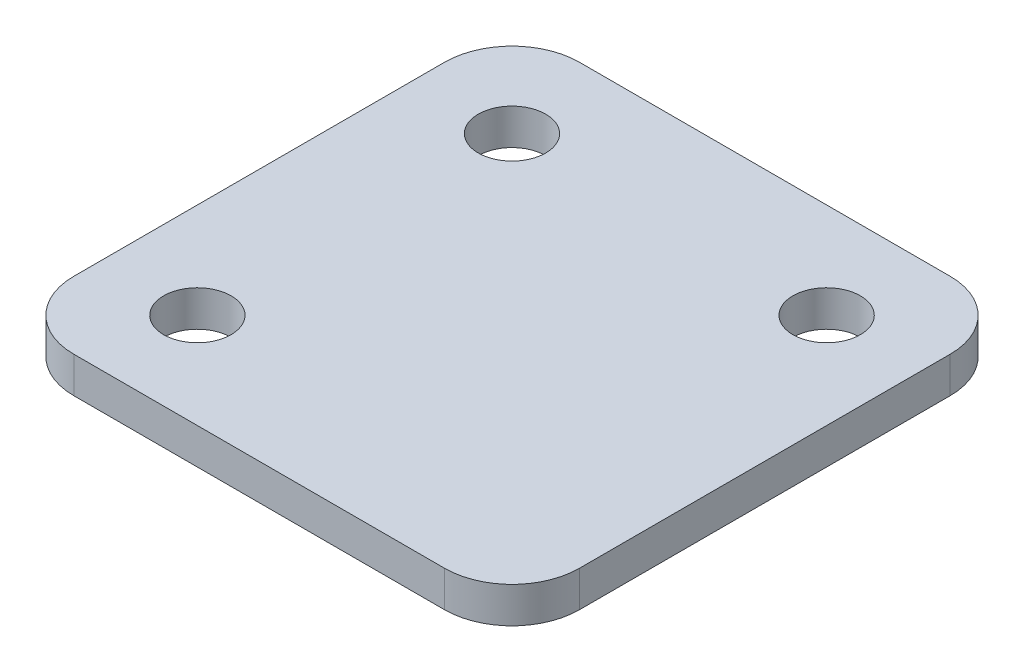
ISO-10303-21;
HEADER;
FILE_DESCRIPTION(('STEP AP214'),'2;1');
FILE_NAME('part.step','',(''),(''),'','','');
FILE_SCHEMA(('AUTOMOTIVE_DESIGN { 1 0 10303 214 1 1 1 1 }'));
ENDSEC;
DATA;
#1=APPLICATION_CONTEXT('core data for automotive mechanical design processes');
#2=APPLICATION_PROTOCOL_DEFINITION('international standard','automotive_design',2000,#1);
#3=PRODUCT_CONTEXT('',#1,'mechanical');
#4=PRODUCT('Part','Part','',(#3));
#5=PRODUCT_RELATED_PRODUCT_CATEGORY('part','',(#4));
#6=PRODUCT_DEFINITION_FORMATION('','',#4);
#7=PRODUCT_DEFINITION_CONTEXT('part definition',#1,'design');
#8=PRODUCT_DEFINITION('design','',#6,#7);
#9=PRODUCT_DEFINITION_SHAPE('','',#8);
#10=(LENGTH_UNIT() NAMED_UNIT(*) SI_UNIT(.MILLI.,.METRE.));
#11=(NAMED_UNIT(*) PLANE_ANGLE_UNIT() SI_UNIT($,.RADIAN.));
#12=(NAMED_UNIT(*) SI_UNIT($,.STERADIAN.) SOLID_ANGLE_UNIT());
#13=UNCERTAINTY_MEASURE_WITH_UNIT(LENGTH_MEASURE(1.E-05),#10,'distance_accuracy_value','');
#14=(GEOMETRIC_REPRESENTATION_CONTEXT(3) GLOBAL_UNCERTAINTY_ASSIGNED_CONTEXT((#13)) GLOBAL_UNIT_ASSIGNED_CONTEXT((#10,
#11,#12)) REPRESENTATION_CONTEXT('',''));
#15=CARTESIAN_POINT('',(0.,0.,0.));
#16=DIRECTION('',(0.,0.,1.));
#17=DIRECTION('',(1.,0.,0.));
#18=AXIS2_PLACEMENT_3D('',#15,#16,#17);
#19=CARTESIAN_POINT('',(-8.24999999999999,0.,8.25));
#20=DIRECTION('',(0.,-1.,0.));
#21=DIRECTION('',(0.,0.,-1.));
#22=AXIS2_PLACEMENT_3D('',#19,#20,#21);
#23=PLANE('',#22);
#24=CARTESIAN_POINT('',(-6.99999999999999,0.,-7.));
#25=DIRECTION('',(0.,1.,0.));
#26=DIRECTION('',(0.,0.,-1.));
#27=AXIS2_PLACEMENT_3D('',#24,#25,#26);
#28=CIRCLE('',#27,1.5);
#29=CARTESIAN_POINT('',(-6.99999999999999,0.,-8.5));
#30=VERTEX_POINT('',#29);
#31=EDGE_CURVE('E232',#30,#30,#28,.T.);
#32=ORIENTED_EDGE('',*,*,#31,.T.);
#33=EDGE_LOOP('',(#32));
#34=FACE_BOUND('',#33,.T.);
#35=CARTESIAN_POINT('',(-8.24999999999999,0.,8.25));
#36=DIRECTION('',(0.,1.,0.));
#37=DIRECTION('',(0.,0.,-1.));
#38=AXIS2_PLACEMENT_3D('',#35,#36,#37);
#39=CIRCLE('',#38,3.);
#40=CARTESIAN_POINT('',(-11.25,0.,8.24999999999998));
#41=VERTEX_POINT('',#40);
#42=CARTESIAN_POINT('',(-8.24999999999997,0.,11.25));
#43=VERTEX_POINT('',#42);
#44=EDGE_CURVE('E156',#41,#43,#39,.T.);
#45=ORIENTED_EDGE('',*,*,#44,.F.);
#46=DIRECTION('',(0.,0.,1.));
#47=VECTOR('',#46,1.);
#48=CARTESIAN_POINT('',(-11.25,0.,-8.24999999999998));
#49=LINE('',#48,#47);
#50=CARTESIAN_POINT('',(-11.25,0.,-8.24999999999998));
#51=VERTEX_POINT('',#50);
#52=EDGE_CURVE('E99',#51,#41,#49,.T.);
#53=ORIENTED_EDGE('',*,*,#52,.F.);
#54=CARTESIAN_POINT('',(-8.25,0.,-8.25));
#55=DIRECTION('',(0.,1.,0.));
#56=DIRECTION('',(0.,0.,1.));
#57=AXIS2_PLACEMENT_3D('',#54,#55,#56);
#58=CIRCLE('',#57,3.);
#59=CARTESIAN_POINT('',(-8.24999999999998,0.,-11.25));
#60=VERTEX_POINT('',#59);
#61=EDGE_CURVE('E175',#60,#51,#58,.T.);
#62=ORIENTED_EDGE('',*,*,#61,.F.);
#63=DIRECTION('',(-1.,0.,0.));
#64=VECTOR('',#63,1.);
#65=CARTESIAN_POINT('',(8.24999999999998,0.,-11.25));
#66=LINE('',#65,#64);
#67=CARTESIAN_POINT('',(8.24999999999998,0.,-11.25));
#68=VERTEX_POINT('',#67);
#69=EDGE_CURVE('E141',#68,#60,#66,.T.);
#70=ORIENTED_EDGE('',*,*,#69,.F.);
#71=CARTESIAN_POINT('',(8.25,0.,-8.25));
#72=DIRECTION('',(0.,1.,0.));
#73=DIRECTION('',(0.,0.,-1.));
#74=AXIS2_PLACEMENT_3D('',#71,#72,#73);
#75=CIRCLE('',#74,3.);
#76=CARTESIAN_POINT('',(11.25,0.,-8.24999999999998));
#77=VERTEX_POINT('',#76);
#78=EDGE_CURVE('E170',#77,#68,#75,.T.);
#79=ORIENTED_EDGE('',*,*,#78,.F.);
#80=DIRECTION('',(0.,0.,-1.));
#81=VECTOR('',#80,1.);
#82=CARTESIAN_POINT('',(11.25,0.,-8.24999999999998));
#83=LINE('',#82,#81);
#84=CARTESIAN_POINT('',(11.25,0.,8.24999999999998));
#85=VERTEX_POINT('',#84);
#86=EDGE_CURVE('E167',#85,#77,#83,.T.);
#87=ORIENTED_EDGE('',*,*,#86,.F.);
#88=CARTESIAN_POINT('',(8.25,0.,8.25));
#89=DIRECTION('',(0.,1.,0.));
#90=DIRECTION('',(0.,0.,-1.));
#91=AXIS2_PLACEMENT_3D('',#88,#89,#90);
#92=CIRCLE('',#91,3.);
#93=CARTESIAN_POINT('',(8.24999999999998,0.,11.25));
#94=VERTEX_POINT('',#93);
#95=EDGE_CURVE('E164',#94,#85,#92,.T.);
#96=ORIENTED_EDGE('',*,*,#95,.F.);
#97=DIRECTION('',(1.,0.,0.));
#98=VECTOR('',#97,1.);
#99=CARTESIAN_POINT('',(8.24999999999998,0.,11.25));
#100=LINE('',#99,#98);
#101=EDGE_CURVE('E160',#43,#94,#100,.T.);
#102=ORIENTED_EDGE('',*,*,#101,.F.);
#103=EDGE_LOOP('',(#45,#53,#62,#70,#79,#87,#96,#102));
#104=FACE_BOUND('',#103,.T.);
#105=CARTESIAN_POINT('',(7.,0.,-7.));
#106=DIRECTION('',(0.,1.,0.));
#107=DIRECTION('',(0.,0.,1.));
#108=AXIS2_PLACEMENT_3D('',#105,#106,#107);
#109=CIRCLE('',#108,1.5);
#110=CARTESIAN_POINT('',(7.,0.,-5.5));
#111=VERTEX_POINT('',#110);
#112=EDGE_CURVE('E224',#111,#111,#109,.T.);
#113=ORIENTED_EDGE('',*,*,#112,.T.);
#114=EDGE_LOOP('',(#113));
#115=FACE_BOUND('',#114,.T.);
#116=CARTESIAN_POINT('',(-6.99999999999999,0.,6.99999999999999));
#117=DIRECTION('',(0.,1.,0.));
#118=DIRECTION('',(0.,0.,1.));
#119=AXIS2_PLACEMENT_3D('',#116,#117,#118);
#120=CIRCLE('',#119,1.5);
#121=CARTESIAN_POINT('',(-6.99999999999999,0.,8.49999999999999));
#122=VERTEX_POINT('',#121);
#123=EDGE_CURVE('E240',#122,#122,#120,.T.);
#124=ORIENTED_EDGE('',*,*,#123,.T.);
#125=EDGE_LOOP('',(#124));
#126=FACE_BOUND('',#125,.T.);
#127=DIRECTION('',(-1.,0.,0.));
#128=VECTOR('',#127,1.);
#129=CARTESIAN_POINT('',(-2.15,0.,2.6));
#130=LINE('',#129,#128);
#131=CARTESIAN_POINT('',(2.15,0.,2.6));
#132=VERTEX_POINT('',#131);
#133=CARTESIAN_POINT('',(-2.15,0.,2.6));
#134=VERTEX_POINT('',#133);
#135=EDGE_CURVE('E269',#132,#134,#130,.T.);
#136=ORIENTED_EDGE('',*,*,#135,.F.);
#137=DIRECTION('',(0.,0.,1.));
#138=VECTOR('',#137,1.);
#139=CARTESIAN_POINT('',(2.15,0.,2.6));
#140=LINE('',#139,#138);
#141=CARTESIAN_POINT('',(2.15,0.,-2.6));
#142=VERTEX_POINT('',#141);
#143=EDGE_CURVE('E273',#142,#132,#140,.T.);
#144=ORIENTED_EDGE('',*,*,#143,.F.);
#145=DIRECTION('',(1.,0.,0.));
#146=VECTOR('',#145,1.);
#147=CARTESIAN_POINT('',(-2.15,0.,-2.6));
#148=LINE('',#147,#146);
#149=CARTESIAN_POINT('',(-2.15,0.,-2.6));
#150=VERTEX_POINT('',#149);
#151=EDGE_CURVE('E262',#150,#142,#148,.T.);
#152=ORIENTED_EDGE('',*,*,#151,.F.);
#153=DIRECTION('',(0.,0.,-1.));
#154=VECTOR('',#153,1.);
#155=CARTESIAN_POINT('',(-2.15,0.,2.6));
#156=LINE('',#155,#154);
#157=EDGE_CURVE('E266',#134,#150,#156,.T.);
#158=ORIENTED_EDGE('',*,*,#157,.F.);
#159=EDGE_LOOP('',(#136,#144,#152,#158));
#160=FACE_BOUND('',#159,.T.);
#161=ADVANCED_FACE('F41',(#34,#104,#115,#126,#160),#23,.T.);
#162=CARTESIAN_POINT('',(-8.24999999999999,1.6,8.25));
#163=DIRECTION('',(0.,-1.,0.));
#164=DIRECTION('',(0.,0.,-1.));
#165=AXIS2_PLACEMENT_3D('',#162,#163,#164);
#166=PLANE('',#165);
#167=CARTESIAN_POINT('',(-8.24999999999999,1.6,8.25));
#168=DIRECTION('',(0.,1.,0.));
#169=DIRECTION('',(0.,0.,-1.));
#170=AXIS2_PLACEMENT_3D('',#167,#168,#169);
#171=CIRCLE('',#170,3.);
#172=CARTESIAN_POINT('',(-11.25,1.6,8.24999999999998));
#173=VERTEX_POINT('',#172);
#174=CARTESIAN_POINT('',(-8.24999999999997,1.6,11.25));
#175=VERTEX_POINT('',#174);
#176=EDGE_CURVE('E180',#173,#175,#171,.T.);
#177=ORIENTED_EDGE('',*,*,#176,.T.);
#178=DIRECTION('',(1.,0.,0.));
#179=VECTOR('',#178,1.);
#180=CARTESIAN_POINT('',(8.24999999999998,1.6,11.25));
#181=LINE('',#180,#179);
#182=CARTESIAN_POINT('',(8.24999999999998,1.6,11.25));
#183=VERTEX_POINT('',#182);
#184=EDGE_CURVE('E107',#175,#183,#181,.T.);
#185=ORIENTED_EDGE('',*,*,#184,.T.);
#186=CARTESIAN_POINT('',(8.25,1.6,8.25));
#187=DIRECTION('',(0.,1.,0.));
#188=DIRECTION('',(0.,0.,-1.));
#189=AXIS2_PLACEMENT_3D('',#186,#187,#188);
#190=CIRCLE('',#189,3.);
#191=CARTESIAN_POINT('',(11.25,1.6,8.24999999999998));
#192=VERTEX_POINT('',#191);
#193=EDGE_CURVE('E201',#183,#192,#190,.T.);
#194=ORIENTED_EDGE('',*,*,#193,.T.);
#195=DIRECTION('',(0.,0.,-1.));
#196=VECTOR('',#195,1.);
#197=CARTESIAN_POINT('',(11.25,1.6,-8.24999999999998));
#198=LINE('',#197,#196);
#199=CARTESIAN_POINT('',(11.25,1.6,-8.24999999999998));
#200=VERTEX_POINT('',#199);
#201=EDGE_CURVE('E214',#192,#200,#198,.T.);
#202=ORIENTED_EDGE('',*,*,#201,.T.);
#203=CARTESIAN_POINT('',(8.25,1.6,-8.25));
#204=DIRECTION('',(0.,1.,0.));
#205=DIRECTION('',(0.,0.,-1.));
#206=AXIS2_PLACEMENT_3D('',#203,#204,#205);
#207=CIRCLE('',#206,3.);
#208=CARTESIAN_POINT('',(8.24999999999998,1.6,-11.25));
#209=VERTEX_POINT('',#208);
#210=EDGE_CURVE('E131',#200,#209,#207,.T.);
#211=ORIENTED_EDGE('',*,*,#210,.T.);
#212=DIRECTION('',(-1.,0.,0.));
#213=VECTOR('',#212,1.);
#214=CARTESIAN_POINT('',(8.24999999999998,1.6,-11.25));
#215=LINE('',#214,#213);
#216=CARTESIAN_POINT('',(-8.24999999999998,1.6,-11.25));
#217=VERTEX_POINT('',#216);
#218=EDGE_CURVE('E123',#209,#217,#215,.T.);
#219=ORIENTED_EDGE('',*,*,#218,.T.);
#220=CARTESIAN_POINT('',(-8.25,1.6,-8.25));
#221=DIRECTION('',(0.,1.,0.));
#222=DIRECTION('',(0.,0.,1.));
#223=AXIS2_PLACEMENT_3D('',#220,#221,#222);
#224=CIRCLE('',#223,3.);
#225=CARTESIAN_POINT('',(-11.25,1.6,-8.24999999999998));
#226=VERTEX_POINT('',#225);
#227=EDGE_CURVE('E128',#217,#226,#224,.T.);
#228=ORIENTED_EDGE('',*,*,#227,.T.);
#229=DIRECTION('',(0.,0.,1.));
#230=VECTOR('',#229,1.);
#231=CARTESIAN_POINT('',(-11.25,1.6,-8.24999999999998));
#232=LINE('',#231,#230);
#233=EDGE_CURVE('E66',#226,#173,#232,.T.);
#234=ORIENTED_EDGE('',*,*,#233,.T.);
#235=EDGE_LOOP('',(#177,#185,#194,#202,#211,#219,#228,#234));
#236=FACE_BOUND('',#235,.T.);
#237=CARTESIAN_POINT('',(7.,1.6,-7.));
#238=DIRECTION('',(0.,1.,0.));
#239=DIRECTION('',(0.,0.,1.));
#240=AXIS2_PLACEMENT_3D('',#237,#238,#239);
#241=CIRCLE('',#240,1.5);
#242=CARTESIAN_POINT('',(7.,1.6,-5.5));
#243=VERTEX_POINT('',#242);
#244=EDGE_CURVE('E161',#243,#243,#241,.T.);
#245=ORIENTED_EDGE('',*,*,#244,.F.);
#246=EDGE_LOOP('',(#245));
#247=FACE_BOUND('',#246,.T.);
#248=CARTESIAN_POINT('',(-6.99999999999999,1.6,-7.));
#249=DIRECTION('',(0.,1.,0.));
#250=DIRECTION('',(0.,0.,-1.));
#251=AXIS2_PLACEMENT_3D('',#248,#249,#250);
#252=CIRCLE('',#251,1.5);
#253=CARTESIAN_POINT('',(-6.99999999999999,1.6,-8.5));
#254=VERTEX_POINT('',#253);
#255=EDGE_CURVE('E228',#254,#254,#252,.T.);
#256=ORIENTED_EDGE('',*,*,#255,.F.);
#257=EDGE_LOOP('',(#256));
#258=FACE_BOUND('',#257,.T.);
#259=CARTESIAN_POINT('',(-6.99999999999999,1.6,6.99999999999999));
#260=DIRECTION('',(0.,1.,0.));
#261=DIRECTION('',(0.,0.,1.));
#262=AXIS2_PLACEMENT_3D('',#259,#260,#261);
#263=CIRCLE('',#262,1.5);
#264=CARTESIAN_POINT('',(-6.99999999999999,1.6,8.49999999999999));
#265=VERTEX_POINT('',#264);
#266=EDGE_CURVE('E236',#265,#265,#263,.T.);
#267=ORIENTED_EDGE('',*,*,#266,.F.);
#268=EDGE_LOOP('',(#267));
#269=FACE_BOUND('',#268,.T.);
#270=ADVANCED_FACE('F125',(#236,#247,#258,#269),#166,.F.);
#271=CARTESIAN_POINT('',(-8.24999999999999,1.6,8.25));
#272=DIRECTION('',(0.,-1.,0.));
#273=DIRECTION('',(0.,0.,-1.));
#274=AXIS2_PLACEMENT_3D('',#271,#272,#273);
#275=CYLINDRICAL_SURFACE('',#274,3.);
#276=ORIENTED_EDGE('',*,*,#44,.T.);
#277=DIRECTION('',(0.,-1.,0.));
#278=VECTOR('',#277,1.);
#279=CARTESIAN_POINT('',(-8.24999999999997,1.6,11.25));
#280=LINE('',#279,#278);
#281=EDGE_CURVE('E11',#175,#43,#280,.T.);
#282=ORIENTED_EDGE('',*,*,#281,.F.);
#283=ORIENTED_EDGE('',*,*,#176,.F.);
#284=DIRECTION('',(0.,-1.,0.));
#285=VECTOR('',#284,1.);
#286=CARTESIAN_POINT('',(-11.25,1.6,8.24999999999998));
#287=LINE('',#286,#285);
#288=EDGE_CURVE('E152',#173,#41,#287,.T.);
#289=ORIENTED_EDGE('',*,*,#288,.T.);
#290=EDGE_LOOP('',(#276,#282,#283,#289));
#291=FACE_BOUND('',#290,.T.);
#292=ADVANCED_FACE('F43',(#291),#275,.T.);
#293=CARTESIAN_POINT('',(8.24999999999998,1.6,11.25));
#294=DIRECTION('',(0.,0.,-1.));
#295=DIRECTION('',(-1.,0.,0.));
#296=AXIS2_PLACEMENT_3D('',#293,#294,#295);
#297=PLANE('',#296);
#298=ORIENTED_EDGE('',*,*,#101,.T.);
#299=DIRECTION('',(0.,-1.,0.));
#300=VECTOR('',#299,1.);
#301=CARTESIAN_POINT('',(8.24999999999998,1.6,11.25));
#302=LINE('',#301,#300);
#303=EDGE_CURVE('E50',#183,#94,#302,.T.);
#304=ORIENTED_EDGE('',*,*,#303,.F.);
#305=ORIENTED_EDGE('',*,*,#184,.F.);
#306=ORIENTED_EDGE('',*,*,#281,.T.);
#307=EDGE_LOOP('',(#298,#304,#305,#306));
#308=FACE_BOUND('',#307,.T.);
#309=ADVANCED_FACE('F342',(#308),#297,.F.);
#310=CARTESIAN_POINT('',(8.25,1.6,8.25));
#311=DIRECTION('',(0.,-1.,0.));
#312=DIRECTION('',(0.,0.,-1.));
#313=AXIS2_PLACEMENT_3D('',#310,#311,#312);
#314=CYLINDRICAL_SURFACE('',#313,3.);
#315=ORIENTED_EDGE('',*,*,#95,.T.);
#316=DIRECTION('',(0.,-1.,0.));
#317=VECTOR('',#316,1.);
#318=CARTESIAN_POINT('',(11.25,1.6,8.24999999999998));
#319=LINE('',#318,#317);
#320=EDGE_CURVE('E191',#192,#85,#319,.T.);
#321=ORIENTED_EDGE('',*,*,#320,.F.);
#322=ORIENTED_EDGE('',*,*,#193,.F.);
#323=ORIENTED_EDGE('',*,*,#303,.T.);
#324=EDGE_LOOP('',(#315,#321,#322,#323));
#325=FACE_BOUND('',#324,.T.);
#326=ADVANCED_FACE('F199',(#325),#314,.T.);
#327=CARTESIAN_POINT('',(11.25,1.6,-8.24999999999998));
#328=DIRECTION('',(-1.,0.,0.));
#329=DIRECTION('',(0.,0.,1.));
#330=AXIS2_PLACEMENT_3D('',#327,#328,#329);
#331=PLANE('',#330);
#332=ORIENTED_EDGE('',*,*,#86,.T.);
#333=DIRECTION('',(0.,-1.,0.));
#334=VECTOR('',#333,1.);
#335=CARTESIAN_POINT('',(11.25,1.6,-8.24999999999998));
#336=LINE('',#335,#334);
#337=EDGE_CURVE('E187',#200,#77,#336,.T.);
#338=ORIENTED_EDGE('',*,*,#337,.F.);
#339=ORIENTED_EDGE('',*,*,#201,.F.);
#340=ORIENTED_EDGE('',*,*,#320,.T.);
#341=EDGE_LOOP('',(#332,#338,#339,#340));
#342=FACE_BOUND('',#341,.T.);
#343=ADVANCED_FACE('F209',(#342),#331,.F.);
#344=CARTESIAN_POINT('',(8.25,1.6,-8.25));
#345=DIRECTION('',(0.,-1.,0.));
#346=DIRECTION('',(0.,0.,-1.));
#347=AXIS2_PLACEMENT_3D('',#344,#345,#346);
#348=CYLINDRICAL_SURFACE('',#347,3.);
#349=ORIENTED_EDGE('',*,*,#78,.T.);
#350=DIRECTION('',(0.,-1.,0.));
#351=VECTOR('',#350,1.);
#352=CARTESIAN_POINT('',(8.24999999999998,1.6,-11.25));
#353=LINE('',#352,#351);
#354=EDGE_CURVE('E145',#209,#68,#353,.T.);
#355=ORIENTED_EDGE('',*,*,#354,.F.);
#356=ORIENTED_EDGE('',*,*,#210,.F.);
#357=ORIENTED_EDGE('',*,*,#337,.T.);
#358=EDGE_LOOP('',(#349,#355,#356,#357));
#359=FACE_BOUND('',#358,.T.);
#360=ADVANCED_FACE('F212',(#359),#348,.T.);
#361=CARTESIAN_POINT('',(8.24999999999998,1.6,-11.25));
#362=DIRECTION('',(0.,0.,1.));
#363=DIRECTION('',(1.,0.,0.));
#364=AXIS2_PLACEMENT_3D('',#361,#362,#363);
#365=PLANE('',#364);
#366=ORIENTED_EDGE('',*,*,#69,.T.);
#367=DIRECTION('',(0.,-1.,0.));
#368=VECTOR('',#367,1.);
#369=CARTESIAN_POINT('',(-8.24999999999998,1.6,-11.25));
#370=LINE('',#369,#368);
#371=EDGE_CURVE('E138',#217,#60,#370,.T.);
#372=ORIENTED_EDGE('',*,*,#371,.F.);
#373=ORIENTED_EDGE('',*,*,#218,.F.);
#374=ORIENTED_EDGE('',*,*,#354,.T.);
#375=EDGE_LOOP('',(#366,#372,#373,#374));
#376=FACE_BOUND('',#375,.T.);
#377=ADVANCED_FACE('F139',(#376),#365,.F.);
#378=CARTESIAN_POINT('',(-8.25,1.6,-8.25));
#379=DIRECTION('',(0.,-1.,0.));
#380=DIRECTION('',(0.,0.,-1.));
#381=AXIS2_PLACEMENT_3D('',#378,#379,#380);
#382=CYLINDRICAL_SURFACE('',#381,3.);
#383=ORIENTED_EDGE('',*,*,#61,.T.);
#384=DIRECTION('',(0.,-1.,0.));
#385=VECTOR('',#384,1.);
#386=CARTESIAN_POINT('',(-11.25,1.6,-8.24999999999998));
#387=LINE('',#386,#385);
#388=EDGE_CURVE('E146',#226,#51,#387,.T.);
#389=ORIENTED_EDGE('',*,*,#388,.F.);
#390=ORIENTED_EDGE('',*,*,#227,.F.);
#391=ORIENTED_EDGE('',*,*,#371,.T.);
#392=EDGE_LOOP('',(#383,#389,#390,#391));
#393=FACE_BOUND('',#392,.T.);
#394=ADVANCED_FACE('F148',(#393),#382,.T.);
#395=CARTESIAN_POINT('',(-11.25,1.6,-8.24999999999998));
#396=DIRECTION('',(1.,0.,0.));
#397=DIRECTION('',(0.,0.,-1.));
#398=AXIS2_PLACEMENT_3D('',#395,#396,#397);
#399=PLANE('',#398);
#400=ORIENTED_EDGE('',*,*,#52,.T.);
#401=ORIENTED_EDGE('',*,*,#288,.F.);
#402=ORIENTED_EDGE('',*,*,#233,.F.);
#403=ORIENTED_EDGE('',*,*,#388,.T.);
#404=EDGE_LOOP('',(#400,#401,#402,#403));
#405=FACE_BOUND('',#404,.T.);
#406=ADVANCED_FACE('F329',(#405),#399,.F.);
#407=CARTESIAN_POINT('',(7.,1.6,-7.));
#408=DIRECTION('',(0.,-1.,0.));
#409=DIRECTION('',(0.,0.,-1.));
#410=AXIS2_PLACEMENT_3D('',#407,#408,#409);
#411=CYLINDRICAL_SURFACE('',#410,1.5);
#412=ORIENTED_EDGE('',*,*,#244,.T.);
#413=EDGE_LOOP('',(#412));
#414=FACE_BOUND('',#413,.T.);
#415=ORIENTED_EDGE('',*,*,#112,.F.);
#416=EDGE_LOOP('',(#415));
#417=FACE_BOUND('',#416,.T.);
#418=ADVANCED_FACE('F332',(#414,#417),#411,.F.);
#419=CARTESIAN_POINT('',(-6.99999999999999,1.6,-7.));
#420=DIRECTION('',(0.,-1.,0.));
#421=DIRECTION('',(0.,0.,-1.));
#422=AXIS2_PLACEMENT_3D('',#419,#420,#421);
#423=CYLINDRICAL_SURFACE('',#422,1.5);
#424=ORIENTED_EDGE('',*,*,#255,.T.);
#425=EDGE_LOOP('',(#424));
#426=FACE_BOUND('',#425,.T.);
#427=ORIENTED_EDGE('',*,*,#31,.F.);
#428=EDGE_LOOP('',(#427));
#429=FACE_BOUND('',#428,.T.);
#430=ADVANCED_FACE('F402',(#426,#429),#423,.F.);
#431=CARTESIAN_POINT('',(-6.99999999999999,1.6,6.99999999999999));
#432=DIRECTION('',(0.,-1.,0.));
#433=DIRECTION('',(0.,0.,-1.));
#434=AXIS2_PLACEMENT_3D('',#431,#432,#433);
#435=CYLINDRICAL_SURFACE('',#434,1.5);
#436=ORIENTED_EDGE('',*,*,#266,.T.);
#437=EDGE_LOOP('',(#436));
#438=FACE_BOUND('',#437,.T.);
#439=ORIENTED_EDGE('',*,*,#123,.F.);
#440=EDGE_LOOP('',(#439));
#441=FACE_BOUND('',#440,.T.);
#442=ADVANCED_FACE('F410',(#438,#441),#435,.F.);
#443=CARTESIAN_POINT('',(2.15,-1.,2.6));
#444=DIRECTION('',(-1.,0.,0.));
#445=DIRECTION('',(0.,0.,1.));
#446=AXIS2_PLACEMENT_3D('',#443,#444,#445);
#447=PLANE('',#446);
#448=ORIENTED_EDGE('',*,*,#143,.T.);
#449=DIRECTION('',(0.,1.,0.));
#450=VECTOR('',#449,1.);
#451=CARTESIAN_POINT('',(2.15,-1.,2.6));
#452=LINE('',#451,#450);
#453=CARTESIAN_POINT('',(2.15,-1.,2.6));
#454=VERTEX_POINT('',#453);
#455=EDGE_CURVE('E244',#454,#132,#452,.T.);
#456=ORIENTED_EDGE('',*,*,#455,.F.);
#457=DIRECTION('',(0.,0.,1.));
#458=VECTOR('',#457,1.);
#459=CARTESIAN_POINT('',(2.15,-1.,2.6));
#460=LINE('',#459,#458);
#461=CARTESIAN_POINT('',(2.15,-1.,-2.6));
#462=VERTEX_POINT('',#461);
#463=EDGE_CURVE('E265',#462,#454,#460,.T.);
#464=ORIENTED_EDGE('',*,*,#463,.F.);
#465=DIRECTION('',(0.,1.,0.));
#466=VECTOR('',#465,1.);
#467=CARTESIAN_POINT('',(2.15,-1.,-2.6));
#468=LINE('',#467,#466);
#469=EDGE_CURVE('E257',#462,#142,#468,.T.);
#470=ORIENTED_EDGE('',*,*,#469,.T.);
#471=EDGE_LOOP('',(#448,#456,#464,#470));
#472=FACE_BOUND('',#471,.T.);
#473=ADVANCED_FACE('F301',(#472),#447,.F.);
#474=CARTESIAN_POINT('',(-2.15,-1.,2.6));
#475=DIRECTION('',(0.,0.,-1.));
#476=DIRECTION('',(-1.,0.,0.));
#477=AXIS2_PLACEMENT_3D('',#474,#475,#476);
#478=PLANE('',#477);
#479=ORIENTED_EDGE('',*,*,#135,.T.);
#480=DIRECTION('',(0.,1.,0.));
#481=VECTOR('',#480,1.);
#482=CARTESIAN_POINT('',(-2.15,-1.,2.6));
#483=LINE('',#482,#481);
#484=CARTESIAN_POINT('',(-2.15,-1.,2.6));
#485=VERTEX_POINT('',#484);
#486=EDGE_CURVE('E251',#485,#134,#483,.T.);
#487=ORIENTED_EDGE('',*,*,#486,.F.);
#488=DIRECTION('',(-1.,0.,0.));
#489=VECTOR('',#488,1.);
#490=CARTESIAN_POINT('',(-2.15,-1.,2.6));
#491=LINE('',#490,#489);
#492=EDGE_CURVE('E284',#454,#485,#491,.T.);
#493=ORIENTED_EDGE('',*,*,#492,.F.);
#494=ORIENTED_EDGE('',*,*,#455,.T.);
#495=EDGE_LOOP('',(#479,#487,#493,#494));
#496=FACE_BOUND('',#495,.T.);
#497=ADVANCED_FACE('F306',(#496),#478,.F.);
#498=CARTESIAN_POINT('',(-2.15,-1.,2.6));
#499=DIRECTION('',(1.,0.,0.));
#500=DIRECTION('',(0.,0.,-1.));
#501=AXIS2_PLACEMENT_3D('',#498,#499,#500);
#502=PLANE('',#501);
#503=ORIENTED_EDGE('',*,*,#157,.T.);
#504=DIRECTION('',(0.,1.,0.));
#505=VECTOR('',#504,1.);
#506=CARTESIAN_POINT('',(-2.15,-1.,-2.6));
#507=LINE('',#506,#505);
#508=CARTESIAN_POINT('',(-2.15,-1.,-2.6));
#509=VERTEX_POINT('',#508);
#510=EDGE_CURVE('E57',#509,#150,#507,.T.);
#511=ORIENTED_EDGE('',*,*,#510,.F.);
#512=DIRECTION('',(0.,0.,-1.));
#513=VECTOR('',#512,1.);
#514=CARTESIAN_POINT('',(-2.15,-1.,2.6));
#515=LINE('',#514,#513);
#516=EDGE_CURVE('E280',#485,#509,#515,.T.);
#517=ORIENTED_EDGE('',*,*,#516,.F.);
#518=ORIENTED_EDGE('',*,*,#486,.T.);
#519=EDGE_LOOP('',(#503,#511,#517,#518));
#520=FACE_BOUND('',#519,.T.);
#521=ADVANCED_FACE('F315',(#520),#502,.F.);
#522=CARTESIAN_POINT('',(-2.15,-1.,-2.6));
#523=DIRECTION('',(0.,0.,1.));
#524=DIRECTION('',(1.,0.,0.));
#525=AXIS2_PLACEMENT_3D('',#522,#523,#524);
#526=PLANE('',#525);
#527=ORIENTED_EDGE('',*,*,#151,.T.);
#528=ORIENTED_EDGE('',*,*,#469,.F.);
#529=DIRECTION('',(1.,0.,0.));
#530=VECTOR('',#529,1.);
#531=CARTESIAN_POINT('',(-2.15,-1.,-2.6));
#532=LINE('',#531,#530);
#533=EDGE_CURVE('E261',#509,#462,#532,.T.);
#534=ORIENTED_EDGE('',*,*,#533,.F.);
#535=ORIENTED_EDGE('',*,*,#510,.T.);
#536=EDGE_LOOP('',(#527,#528,#534,#535));
#537=FACE_BOUND('',#536,.T.);
#538=ADVANCED_FACE('F318',(#537),#526,.F.);
#539=CARTESIAN_POINT('',(0.,-1.,0.));
#540=DIRECTION('',(0.,-1.,0.));
#541=DIRECTION('',(0.,0.,-1.));
#542=AXIS2_PLACEMENT_3D('',#539,#540,#541);
#543=PLANE('',#542);
#544=ORIENTED_EDGE('',*,*,#463,.T.);
#545=ORIENTED_EDGE('',*,*,#492,.T.);
#546=ORIENTED_EDGE('',*,*,#516,.T.);
#547=ORIENTED_EDGE('',*,*,#533,.T.);
#548=EDGE_LOOP('',(#544,#545,#546,#547));
#549=FACE_BOUND('',#548,.T.);
#550=ADVANCED_FACE('F294',(#549),#543,.T.);
#551=CLOSED_SHELL('',(#161,#270,#292,#309,#326,#343,#360,#377,#394,#406,#418,#430,#442,#473,
#497,#521,#538,#550));
#552=MANIFOLD_SOLID_BREP('B2',#551);
#553=ADVANCED_BREP_SHAPE_REPRESENTATION('',(#18,#552),#14);
#554=SHAPE_DEFINITION_REPRESENTATION(#9,#553);
ENDSEC;
END-ISO-10303-21;
